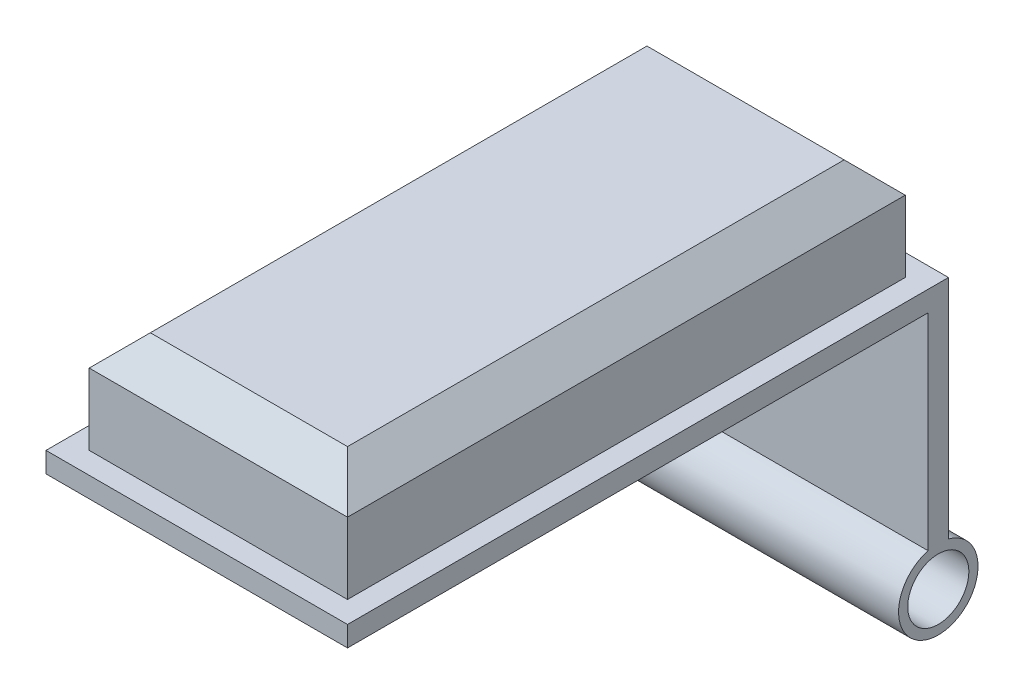
ISO-10303-21;
HEADER;
FILE_DESCRIPTION(('STEP AP214'),'2;1');
FILE_NAME('part.step','',(''),(''),'','','');
FILE_SCHEMA(('AUTOMOTIVE_DESIGN { 1 0 10303 214 1 1 1 1 }'));
ENDSEC;
DATA;
#1=APPLICATION_CONTEXT('core data for automotive mechanical design processes');
#2=APPLICATION_PROTOCOL_DEFINITION('international standard','automotive_design',2000,#1);
#3=PRODUCT_CONTEXT('',#1,'mechanical');
#4=PRODUCT('Part','Part','',(#3));
#5=PRODUCT_RELATED_PRODUCT_CATEGORY('part','',(#4));
#6=PRODUCT_DEFINITION_FORMATION('','',#4);
#7=PRODUCT_DEFINITION_CONTEXT('part definition',#1,'design');
#8=PRODUCT_DEFINITION('design','',#6,#7);
#9=PRODUCT_DEFINITION_SHAPE('','',#8);
#10=(LENGTH_UNIT() NAMED_UNIT(*) SI_UNIT(.MILLI.,.METRE.));
#11=(NAMED_UNIT(*) PLANE_ANGLE_UNIT() SI_UNIT($,.RADIAN.));
#12=(NAMED_UNIT(*) SI_UNIT($,.STERADIAN.) SOLID_ANGLE_UNIT());
#13=UNCERTAINTY_MEASURE_WITH_UNIT(LENGTH_MEASURE(1.E-05),#10,'distance_accuracy_value','');
#14=(GEOMETRIC_REPRESENTATION_CONTEXT(3) GLOBAL_UNCERTAINTY_ASSIGNED_CONTEXT((#13)) GLOBAL_UNIT_ASSIGNED_CONTEXT((#10,
#11,#12)) REPRESENTATION_CONTEXT('',''));
#15=CARTESIAN_POINT('',(0.,0.,0.));
#16=DIRECTION('',(0.,0.,1.));
#17=DIRECTION('',(1.,0.,0.));
#18=AXIS2_PLACEMENT_3D('',#15,#16,#17);
#19=CARTESIAN_POINT('',(0.,12.9969134233995,29.));
#20=DIRECTION('',(0.,1.,0.));
#21=DIRECTION('',(0.,0.,1.));
#22=AXIS2_PLACEMENT_3D('',#19,#20,#21);
#23=PLANE('',#22);
#24=DIRECTION('',(0.,0.,-1.));
#25=VECTOR('',#24,1.);
#26=CARTESIAN_POINT('',(0.,12.9969134233995,0.));
#27=LINE('',#26,#25);
#28=CARTESIAN_POINT('',(0.,12.9969134233995,29.));
#29=VERTEX_POINT('',#28);
#30=CARTESIAN_POINT('',(0.,12.9969134233995,-0.498993341804118));
#31=VERTEX_POINT('',#30);
#32=EDGE_CURVE('E158',#29,#31,#27,.T.);
#33=ORIENTED_EDGE('',*,*,#32,.F.);
#34=DIRECTION('',(1.,0.,0.));
#35=VECTOR('',#34,1.);
#36=CARTESIAN_POINT('',(0.,12.9969134233995,29.));
#37=LINE('',#36,#35);
#38=CARTESIAN_POINT('',(14.8,12.9969134233995,29.));
#39=VERTEX_POINT('',#38);
#40=EDGE_CURVE('E12',#29,#39,#37,.T.);
#41=ORIENTED_EDGE('',*,*,#40,.T.);
#42=DIRECTION('',(0.,0.,-1.));
#43=VECTOR('',#42,1.);
#44=CARTESIAN_POINT('',(14.8,12.9969134233995,0.));
#45=LINE('',#44,#43);
#46=CARTESIAN_POINT('',(14.8,12.9969134233995,-0.498993341804118));
#47=VERTEX_POINT('',#46);
#48=EDGE_CURVE('E62',#39,#47,#45,.T.);
#49=ORIENTED_EDGE('',*,*,#48,.T.);
#50=DIRECTION('',(-1.,0.,0.));
#51=VECTOR('',#50,1.);
#52=CARTESIAN_POINT('',(14.8,12.9969134233995,-0.498993341804118));
#53=LINE('',#52,#51);
#54=EDGE_CURVE('E150',#47,#31,#53,.T.);
#55=ORIENTED_EDGE('',*,*,#54,.T.);
#56=EDGE_LOOP('',(#33,#41,#49,#55));
#57=FACE_BOUND('',#56,.T.);
#58=ADVANCED_FACE('F45',(#57),#23,.T.);
#59=CARTESIAN_POINT('',(14.8,0.,0.50100665819588));
#60=DIRECTION('',(0.,0.,-1.));
#61=DIRECTION('',(0.,1.,0.));
#62=AXIS2_PLACEMENT_3D('',#59,#60,#61);
#63=PLANE('',#62);
#64=DIRECTION('',(1.,0.,0.));
#65=VECTOR('',#64,1.);
#66=CARTESIAN_POINT('',(0.,11.9969134233995,0.501006658195882));
#67=LINE('',#66,#65);
#68=CARTESIAN_POINT('',(0.,11.9969134233995,0.501006658195882));
#69=VERTEX_POINT('',#68);
#70=CARTESIAN_POINT('',(14.8,11.9969134233995,0.501006658195882));
#71=VERTEX_POINT('',#70);
#72=EDGE_CURVE('E97',#69,#71,#67,.T.);
#73=ORIENTED_EDGE('',*,*,#72,.F.);
#74=DIRECTION('',(0.,-1.,0.));
#75=VECTOR('',#74,1.);
#76=CARTESIAN_POINT('',(0.,0.,0.50100665819588));
#77=LINE('',#76,#75);
#78=CARTESIAN_POINT('',(0.,1.88157923576154,0.501006658195881));
#79=VERTEX_POINT('',#78);
#80=EDGE_CURVE('E77',#69,#79,#77,.T.);
#81=ORIENTED_EDGE('',*,*,#80,.T.);
#82=DIRECTION('',(-1.,0.,0.));
#83=VECTOR('',#82,1.);
#84=CARTESIAN_POINT('',(14.8,1.88157923576154,0.501006658195881));
#85=LINE('',#84,#83);
#86=CARTESIAN_POINT('',(14.8,1.88157923576154,0.501006658195881));
#87=VERTEX_POINT('',#86);
#88=EDGE_CURVE('E180',#87,#79,#85,.T.);
#89=ORIENTED_EDGE('',*,*,#88,.F.);
#90=DIRECTION('',(0.,-1.,0.));
#91=VECTOR('',#90,1.);
#92=CARTESIAN_POINT('',(14.8,0.,0.50100665819588));
#93=LINE('',#92,#91);
#94=EDGE_CURVE('E163',#71,#87,#93,.T.);
#95=ORIENTED_EDGE('',*,*,#94,.F.);
#96=EDGE_LOOP('',(#73,#81,#89,#95));
#97=FACE_BOUND('',#96,.T.);
#98=ADVANCED_FACE('F121',(#97),#63,.F.);
#99=CARTESIAN_POINT('',(14.8,-0.0030865766004935,0.00047216816173915));
#100=DIRECTION('',(-1.,0.,0.));
#101=DIRECTION('',(0.,0.,1.));
#102=AXIS2_PLACEMENT_3D('',#99,#100,#101);
#103=CYLINDRICAL_SURFACE('',#102,1.95);
#104=CARTESIAN_POINT('',(0.,-0.0030865766004935,0.00047216816173915));
#105=DIRECTION('',(1.,0.,0.));
#106=DIRECTION('',(0.,0.,-1.));
#107=AXIS2_PLACEMENT_3D('',#104,#105,#106);
#108=CIRCLE('',#107,1.95);
#109=CARTESIAN_POINT('',(0.,1.88186281379558,-0.498993341804119));
#110=VERTEX_POINT('',#109);
#111=EDGE_CURVE('E157',#79,#110,#108,.T.);
#112=ORIENTED_EDGE('',*,*,#111,.T.);
#113=DIRECTION('',(-1.,0.,0.));
#114=VECTOR('',#113,1.);
#115=CARTESIAN_POINT('',(14.8,1.88186281379558,-0.498993341804119));
#116=LINE('',#115,#114);
#117=CARTESIAN_POINT('',(14.8,1.88186281379558,-0.498993341804119));
#118=VERTEX_POINT('',#117);
#119=EDGE_CURVE('E153',#118,#110,#116,.T.);
#120=ORIENTED_EDGE('',*,*,#119,.F.);
#121=CARTESIAN_POINT('',(14.8,-0.0030865766004935,0.00047216816173915));
#122=DIRECTION('',(1.,0.,0.));
#123=DIRECTION('',(0.,0.,-1.));
#124=AXIS2_PLACEMENT_3D('',#121,#122,#123);
#125=CIRCLE('',#124,1.95);
#126=EDGE_CURVE('E172',#87,#118,#125,.T.);
#127=ORIENTED_EDGE('',*,*,#126,.F.);
#128=ORIENTED_EDGE('',*,*,#88,.T.);
#129=EDGE_LOOP('',(#112,#120,#127,#128));
#130=FACE_BOUND('',#129,.T.);
#131=ADVANCED_FACE('F123',(#130),#103,.T.);
#132=CARTESIAN_POINT('',(14.8,0.,-0.498993341804119));
#133=DIRECTION('',(0.,0.,-1.));
#134=DIRECTION('',(0.,1.,0.));
#135=AXIS2_PLACEMENT_3D('',#132,#133,#134);
#136=PLANE('',#135);
#137=DIRECTION('',(0.,-1.,0.));
#138=VECTOR('',#137,1.);
#139=CARTESIAN_POINT('',(0.,0.,-0.498993341804119));
#140=LINE('',#139,#138);
#141=EDGE_CURVE('E146',#31,#110,#140,.T.);
#142=ORIENTED_EDGE('',*,*,#141,.F.);
#143=ORIENTED_EDGE('',*,*,#54,.F.);
#144=DIRECTION('',(0.,-1.,0.));
#145=VECTOR('',#144,1.);
#146=CARTESIAN_POINT('',(14.8,0.,-0.498993341804119));
#147=LINE('',#146,#145);
#148=EDGE_CURVE('E170',#47,#118,#147,.T.);
#149=ORIENTED_EDGE('',*,*,#148,.T.);
#150=ORIENTED_EDGE('',*,*,#119,.T.);
#151=EDGE_LOOP('',(#142,#143,#149,#150));
#152=FACE_BOUND('',#151,.T.);
#153=ADVANCED_FACE('F130',(#152),#136,.T.);
#154=CARTESIAN_POINT('',(14.8,-0.0030865766004935,0.00047216816173915));
#155=DIRECTION('',(-1.,0.,0.));
#156=DIRECTION('',(0.,0.,1.));
#157=AXIS2_PLACEMENT_3D('',#154,#155,#156);
#158=CYLINDRICAL_SURFACE('',#157,1.5);
#159=CARTESIAN_POINT('',(14.8,-0.0030865766004935,0.00047216816173915));
#160=DIRECTION('',(1.,0.,0.));
#161=DIRECTION('',(0.,0.,-1.));
#162=AXIS2_PLACEMENT_3D('',#159,#160,#161);
#163=CIRCLE('',#162,1.5);
#164=CARTESIAN_POINT('',(14.8,-0.0030865766004935,-1.49952783183826));
#165=VERTEX_POINT('',#164);
#166=EDGE_CURVE('E160',#165,#165,#163,.T.);
#167=ORIENTED_EDGE('',*,*,#166,.T.);
#168=EDGE_LOOP('',(#167));
#169=FACE_BOUND('',#168,.T.);
#170=CARTESIAN_POINT('',(0.,-0.0030865766004935,0.00047216816173915));
#171=DIRECTION('',(1.,0.,0.));
#172=DIRECTION('',(0.,0.,-1.));
#173=AXIS2_PLACEMENT_3D('',#170,#171,#172);
#174=CIRCLE('',#173,1.5);
#175=CARTESIAN_POINT('',(0.,-0.0030865766004935,-1.49952783183826));
#176=VERTEX_POINT('',#175);
#177=EDGE_CURVE('E101',#176,#176,#174,.T.);
#178=ORIENTED_EDGE('',*,*,#177,.F.);
#179=EDGE_LOOP('',(#178));
#180=FACE_BOUND('',#179,.T.);
#181=ADVANCED_FACE('F117',(#169,#180),#158,.F.);
#182=CARTESIAN_POINT('',(14.8,0.,0.));
#183=DIRECTION('',(1.,0.,0.));
#184=DIRECTION('',(0.,0.,-1.));
#185=AXIS2_PLACEMENT_3D('',#182,#183,#184);
#186=PLANE('',#185);
#187=ORIENTED_EDGE('',*,*,#166,.F.);
#188=EDGE_LOOP('',(#187));
#189=FACE_BOUND('',#188,.T.);
#190=ORIENTED_EDGE('',*,*,#48,.F.);
#191=DIRECTION('',(0.,1.,0.));
#192=VECTOR('',#191,1.);
#193=CARTESIAN_POINT('',(14.8,11.9969134233995,29.));
#194=LINE('',#193,#192);
#195=CARTESIAN_POINT('',(14.8,11.9969134233995,29.));
#196=VERTEX_POINT('',#195);
#197=EDGE_CURVE('E80',#196,#39,#194,.T.);
#198=ORIENTED_EDGE('',*,*,#197,.F.);
#199=DIRECTION('',(0.,0.,-1.));
#200=VECTOR('',#199,1.);
#201=CARTESIAN_POINT('',(14.8,11.9969134233995,0.));
#202=LINE('',#201,#200);
#203=EDGE_CURVE('E85',#196,#71,#202,.T.);
#204=ORIENTED_EDGE('',*,*,#203,.T.);
#205=ORIENTED_EDGE('',*,*,#94,.T.);
#206=ORIENTED_EDGE('',*,*,#126,.T.);
#207=ORIENTED_EDGE('',*,*,#148,.F.);
#208=EDGE_LOOP('',(#190,#198,#204,#205,#206,#207));
#209=FACE_BOUND('',#208,.T.);
#210=ADVANCED_FACE('F82',(#189,#209),#186,.T.);
#211=CARTESIAN_POINT('',(0.,0.,0.));
#212=DIRECTION('',(1.,0.,0.));
#213=DIRECTION('',(0.,0.,-1.));
#214=AXIS2_PLACEMENT_3D('',#211,#212,#213);
#215=PLANE('',#214);
#216=ORIENTED_EDGE('',*,*,#177,.T.);
#217=EDGE_LOOP('',(#216));
#218=FACE_BOUND('',#217,.T.);
#219=ORIENTED_EDGE('',*,*,#80,.F.);
#220=DIRECTION('',(0.,0.,1.));
#221=VECTOR('',#220,1.);
#222=CARTESIAN_POINT('',(0.,11.9969134233995,0.));
#223=LINE('',#222,#221);
#224=CARTESIAN_POINT('',(0.,11.9969134233995,29.));
#225=VERTEX_POINT('',#224);
#226=EDGE_CURVE('E89',#69,#225,#223,.T.);
#227=ORIENTED_EDGE('',*,*,#226,.T.);
#228=DIRECTION('',(0.,1.,0.));
#229=VECTOR('',#228,1.);
#230=CARTESIAN_POINT('',(0.,11.9969134233995,29.));
#231=LINE('',#230,#229);
#232=EDGE_CURVE('E90',#225,#29,#231,.T.);
#233=ORIENTED_EDGE('',*,*,#232,.T.);
#234=ORIENTED_EDGE('',*,*,#32,.T.);
#235=ORIENTED_EDGE('',*,*,#141,.T.);
#236=ORIENTED_EDGE('',*,*,#111,.F.);
#237=EDGE_LOOP('',(#219,#227,#233,#234,#235,#236));
#238=FACE_BOUND('',#237,.T.);
#239=ADVANCED_FACE('F108',(#218,#238),#215,.F.);
#240=CARTESIAN_POINT('',(0.,11.9969134233995,29.));
#241=DIRECTION('',(0.,0.,1.));
#242=DIRECTION('',(1.,0.,0.));
#243=AXIS2_PLACEMENT_3D('',#240,#241,#242);
#244=PLANE('',#243);
#245=ORIENTED_EDGE('',*,*,#40,.F.);
#246=ORIENTED_EDGE('',*,*,#232,.F.);
#247=DIRECTION('',(1.,0.,0.));
#248=VECTOR('',#247,1.);
#249=CARTESIAN_POINT('',(0.,11.9969134233995,29.));
#250=LINE('',#249,#248);
#251=EDGE_CURVE('E48',#225,#196,#250,.T.);
#252=ORIENTED_EDGE('',*,*,#251,.T.);
#253=ORIENTED_EDGE('',*,*,#197,.T.);
#254=EDGE_LOOP('',(#245,#246,#252,#253));
#255=FACE_BOUND('',#254,.T.);
#256=ADVANCED_FACE('F98',(#255),#244,.T.);
#257=CARTESIAN_POINT('',(0.,11.9969134233995,0.));
#258=DIRECTION('',(0.,1.,0.));
#259=DIRECTION('',(0.,0.,1.));
#260=AXIS2_PLACEMENT_3D('',#257,#258,#259);
#261=PLANE('',#260);
#262=ORIENTED_EDGE('',*,*,#251,.F.);
#263=ORIENTED_EDGE('',*,*,#226,.F.);
#264=ORIENTED_EDGE('',*,*,#72,.T.);
#265=ORIENTED_EDGE('',*,*,#203,.F.);
#266=EDGE_LOOP('',(#262,#263,#264,#265));
#267=FACE_BOUND('',#266,.T.);
#268=ADVANCED_FACE('F95',(#267),#261,.F.);
#269=CLOSED_SHELL('',(#58,#98,#131,#153,#181,#210,#239,#256,#268));
#270=MANIFOLD_SOLID_BREP('B2',#269);
#271=CARTESIAN_POINT('',(0.,12.9969134233995,29.));
#272=DIRECTION('',(0.,1.,0.));
#273=DIRECTION('',(0.,0.,1.));
#274=AXIS2_PLACEMENT_3D('',#271,#272,#273);
#275=PLANE('',#274);
#276=DIRECTION('',(0.,0.,1.));
#277=VECTOR('',#276,1.);
#278=CARTESIAN_POINT('',(13.7393398282202,12.9969134233995,0.));
#279=LINE('',#278,#277);
#280=CARTESIAN_POINT('',(13.7393398282202,12.9969134233995,0.561666829975703));
#281=VERTEX_POINT('',#280);
#282=CARTESIAN_POINT('',(13.7393398282202,12.9969134233995,27.9393398282202));
#283=VERTEX_POINT('',#282);
#284=EDGE_CURVE('E43',#281,#283,#279,.T.);
#285=ORIENTED_EDGE('',*,*,#284,.T.);
#286=DIRECTION('',(1.,0.,0.));
#287=VECTOR('',#286,1.);
#288=CARTESIAN_POINT('',(0.,12.9969134233995,27.9393398282202));
#289=LINE('',#288,#287);
#290=CARTESIAN_POINT('',(1.06066017177982,12.9969134233995,27.9393398282202));
#291=VERTEX_POINT('',#290);
#292=EDGE_CURVE('E289',#291,#283,#289,.T.);
#293=ORIENTED_EDGE('',*,*,#292,.F.);
#294=DIRECTION('',(0.,0.,1.));
#295=VECTOR('',#294,1.);
#296=CARTESIAN_POINT('',(1.06066017177982,12.9969134233995,0.));
#297=LINE('',#296,#295);
#298=CARTESIAN_POINT('',(1.06066017177982,12.9969134233995,0.561666829975703));
#299=VERTEX_POINT('',#298);
#300=EDGE_CURVE('E321',#299,#291,#297,.T.);
#301=ORIENTED_EDGE('',*,*,#300,.F.);
#302=DIRECTION('',(1.,0.,0.));
#303=VECTOR('',#302,1.);
#304=CARTESIAN_POINT('',(0.,12.9969134233995,0.561666829975703));
#305=LINE('',#304,#303);
#306=EDGE_CURVE('E274',#299,#281,#305,.T.);
#307=ORIENTED_EDGE('',*,*,#306,.T.);
#308=EDGE_LOOP('',(#285,#293,#301,#307));
#309=FACE_BOUND('',#308,.T.);
#310=ADVANCED_FACE('F266',(#309),#275,.F.);
#311=CARTESIAN_POINT('',(0.,17.9969134233995,0.));
#312=DIRECTION('',(0.,1.,0.));
#313=DIRECTION('',(0.,0.,1.));
#314=AXIS2_PLACEMENT_3D('',#311,#312,#313);
#315=PLANE('',#314);
#316=DIRECTION('',(0.,0.,1.));
#317=VECTOR('',#316,1.);
#318=CARTESIAN_POINT('',(2.56066017177982,17.9969134233995,27.9393398282202));
#319=LINE('',#318,#317);
#320=CARTESIAN_POINT('',(2.56066017177982,17.9969134233995,2.06166682997571));
#321=VERTEX_POINT('',#320);
#322=CARTESIAN_POINT('',(2.56066017177982,17.9969134233995,26.4393398282202));
#323=VERTEX_POINT('',#322);
#324=EDGE_CURVE('E345',#321,#323,#319,.T.);
#325=ORIENTED_EDGE('',*,*,#324,.T.);
#326=DIRECTION('',(1.,0.,0.));
#327=VECTOR('',#326,1.);
#328=CARTESIAN_POINT('',(13.7393398282202,17.9969134233995,26.4393398282202));
#329=LINE('',#328,#327);
#330=CARTESIAN_POINT('',(12.2393398282202,17.9969134233995,26.4393398282202));
#331=VERTEX_POINT('',#330);
#332=EDGE_CURVE('E347',#323,#331,#329,.T.);
#333=ORIENTED_EDGE('',*,*,#332,.T.);
#334=DIRECTION('',(0.,0.,-1.));
#335=VECTOR('',#334,1.);
#336=CARTESIAN_POINT('',(12.2393398282202,17.9969134233995,0.));
#337=LINE('',#336,#335);
#338=CARTESIAN_POINT('',(12.2393398282202,17.9969134233995,2.06166682997571));
#339=VERTEX_POINT('',#338);
#340=EDGE_CURVE('E341',#331,#339,#337,.T.);
#341=ORIENTED_EDGE('',*,*,#340,.T.);
#342=DIRECTION('',(-1.,0.,0.));
#343=VECTOR('',#342,1.);
#344=CARTESIAN_POINT('',(0.,17.9969134233995,2.06166682997571));
#345=LINE('',#344,#343);
#346=EDGE_CURVE('E343',#339,#321,#345,.T.);
#347=ORIENTED_EDGE('',*,*,#346,.T.);
#348=EDGE_LOOP('',(#325,#333,#341,#347));
#349=FACE_BOUND('',#348,.T.);
#350=ADVANCED_FACE('F387',(#349),#315,.T.);
#351=CARTESIAN_POINT('',(13.7393398282202,16.4969134233995,0.));
#352=DIRECTION('',(-0.707106781186546,-0.707106781186549,0.));
#353=DIRECTION('',(0.,0.,1.));
#354=AXIS2_PLACEMENT_3D('',#351,#352,#353);
#355=PLANE('',#354);
#356=DIRECTION('',(-0.577350269189627,0.577350269189624,0.577350269189627));
#357=VECTOR('',#356,1.);
#358=CARTESIAN_POINT('',(13.9265621048787,16.3096911467409,0.374444553317135));
#359=LINE('',#358,#357);
#360=CARTESIAN_POINT('',(13.7393398282202,16.4969134233995,0.561666829975703));
#361=VERTEX_POINT('',#360);
#362=EDGE_CURVE('E360',#361,#339,#359,.T.);
#363=ORIENTED_EDGE('',*,*,#362,.T.);
#364=ORIENTED_EDGE('',*,*,#340,.F.);
#365=DIRECTION('',(-0.577350269189627,0.577350269189624,-0.577350269189627));
#366=VECTOR('',#365,1.);
#367=CARTESIAN_POINT('',(4.42622655214675,25.8100266994729,18.6262265521468));
#368=LINE('',#367,#366);
#369=CARTESIAN_POINT('',(13.7393398282202,16.4969134233995,27.9393398282202));
#370=VERTEX_POINT('',#369);
#371=EDGE_CURVE('E357',#370,#331,#368,.T.);
#372=ORIENTED_EDGE('',*,*,#371,.F.);
#373=DIRECTION('',(0.,0.,1.));
#374=VECTOR('',#373,1.);
#375=CARTESIAN_POINT('',(13.7393398282202,16.4969134233995,0.));
#376=LINE('',#375,#374);
#377=EDGE_CURVE('E355',#361,#370,#376,.T.);
#378=ORIENTED_EDGE('',*,*,#377,.F.);
#379=EDGE_LOOP('',(#363,#364,#372,#378));
#380=FACE_BOUND('',#379,.T.);
#381=ADVANCED_FACE('F385',(#380),#355,.F.);
#382=CARTESIAN_POINT('',(0.,16.4969134233995,0.561666829975703));
#383=DIRECTION('',(0.,-0.707106781186549,0.707106781186546));
#384=DIRECTION('',(1.,0.,0.));
#385=AXIS2_PLACEMENT_3D('',#382,#383,#384);
#386=PLANE('',#385);
#387=ORIENTED_EDGE('',*,*,#362,.F.);
#388=DIRECTION('',(1.,0.,0.));
#389=VECTOR('',#388,1.);
#390=CARTESIAN_POINT('',(0.,16.4969134233995,0.561666829975703));
#391=LINE('',#390,#389);
#392=CARTESIAN_POINT('',(1.06066017177982,16.4969134233995,0.561666829975703));
#393=VERTEX_POINT('',#392);
#394=EDGE_CURVE('E353',#393,#361,#391,.T.);
#395=ORIENTED_EDGE('',*,*,#394,.F.);
#396=DIRECTION('',(-0.577350269189627,-0.577350269189624,-0.577350269189627));
#397=VECTOR('',#396,1.);
#398=CARTESIAN_POINT('',(0.707106781186546,16.1433600328062,0.208113439382429));
#399=LINE('',#398,#397);
#400=EDGE_CURVE('E269',#321,#393,#399,.T.);
#401=ORIENTED_EDGE('',*,*,#400,.F.);
#402=ORIENTED_EDGE('',*,*,#346,.F.);
#403=EDGE_LOOP('',(#387,#395,#401,#402));
#404=FACE_BOUND('',#403,.T.);
#405=ADVANCED_FACE('F376',(#404),#386,.F.);
#406=CARTESIAN_POINT('',(0.,17.9969134233995,0.561666829975703));
#407=DIRECTION('',(0.,0.,-1.));
#408=DIRECTION('',(-1.,0.,0.));
#409=AXIS2_PLACEMENT_3D('',#406,#407,#408);
#410=PLANE('',#409);
#411=DIRECTION('',(0.,-1.,0.));
#412=VECTOR('',#411,1.);
#413=CARTESIAN_POINT('',(1.06066017177982,17.9969134233995,0.561666829975703));
#414=LINE('',#413,#412);
#415=EDGE_CURVE('E324',#393,#299,#414,.T.);
#416=ORIENTED_EDGE('',*,*,#415,.F.);
#417=ORIENTED_EDGE('',*,*,#394,.T.);
#418=DIRECTION('',(0.,-1.,0.));
#419=VECTOR('',#418,1.);
#420=CARTESIAN_POINT('',(13.7393398282202,17.9969134233995,0.561666829975703));
#421=LINE('',#420,#419);
#422=EDGE_CURVE('E336',#361,#281,#421,.T.);
#423=ORIENTED_EDGE('',*,*,#422,.T.);
#424=ORIENTED_EDGE('',*,*,#306,.F.);
#425=EDGE_LOOP('',(#416,#417,#423,#424));
#426=FACE_BOUND('',#425,.T.);
#427=ADVANCED_FACE('F378',(#426),#410,.T.);
#428=CARTESIAN_POINT('',(2.56066017177982,17.9969134233995,0.));
#429=DIRECTION('',(-0.707106781186546,0.707106781186549,0.));
#430=DIRECTION('',(0.,0.,-1.));
#431=AXIS2_PLACEMENT_3D('',#428,#429,#430);
#432=PLANE('',#431);
#433=ORIENTED_EDGE('',*,*,#400,.T.);
#434=DIRECTION('',(0.,0.,-1.));
#435=VECTOR('',#434,1.);
#436=CARTESIAN_POINT('',(1.06066017177982,16.4969134233995,0.561666829975703));
#437=LINE('',#436,#435);
#438=CARTESIAN_POINT('',(1.06066017177982,16.4969134233995,27.9393398282202));
#439=VERTEX_POINT('',#438);
#440=EDGE_CURVE('E351',#439,#393,#437,.T.);
#441=ORIENTED_EDGE('',*,*,#440,.F.);
#442=DIRECTION('',(0.577350269189627,0.577350269189624,-0.577350269189627));
#443=VECTOR('',#442,1.);
#444=CARTESIAN_POINT('',(11.3737734478532,26.8100266994729,17.6262265521468));
#445=LINE('',#444,#443);
#446=EDGE_CURVE('E359',#323,#439,#445,.F.);
#447=ORIENTED_EDGE('',*,*,#446,.F.);
#448=ORIENTED_EDGE('',*,*,#324,.F.);
#449=EDGE_LOOP('',(#433,#441,#447,#448));
#450=FACE_BOUND('',#449,.T.);
#451=ADVANCED_FACE('F371',(#450),#432,.T.);
#452=CARTESIAN_POINT('',(1.06066017177982,17.9969134233995,0.));
#453=DIRECTION('',(1.,0.,0.));
#454=DIRECTION('',(0.,0.,-1.));
#455=AXIS2_PLACEMENT_3D('',#452,#453,#454);
#456=PLANE('',#455);
#457=DIRECTION('',(0.,-1.,0.));
#458=VECTOR('',#457,1.);
#459=CARTESIAN_POINT('',(1.06066017177982,17.9969134233995,27.9393398282202));
#460=LINE('',#459,#458);
#461=EDGE_CURVE('E323',#439,#291,#460,.T.);
#462=ORIENTED_EDGE('',*,*,#461,.F.);
#463=ORIENTED_EDGE('',*,*,#440,.T.);
#464=ORIENTED_EDGE('',*,*,#415,.T.);
#465=ORIENTED_EDGE('',*,*,#300,.T.);
#466=EDGE_LOOP('',(#462,#463,#464,#465));
#467=FACE_BOUND('',#466,.T.);
#468=ADVANCED_FACE('F322',(#467),#456,.F.);
#469=CARTESIAN_POINT('',(0.,17.9969134233995,26.4393398282202));
#470=DIRECTION('',(0.,0.707106781186549,0.707106781186546));
#471=DIRECTION('',(-1.,0.,0.));
#472=AXIS2_PLACEMENT_3D('',#469,#470,#471);
#473=PLANE('',#472);
#474=ORIENTED_EDGE('',*,*,#446,.T.);
#475=DIRECTION('',(-1.,0.,0.));
#476=VECTOR('',#475,1.);
#477=CARTESIAN_POINT('',(1.06066017177982,16.4969134233995,27.9393398282202));
#478=LINE('',#477,#476);
#479=EDGE_CURVE('E334',#370,#439,#478,.T.);
#480=ORIENTED_EDGE('',*,*,#479,.F.);
#481=ORIENTED_EDGE('',*,*,#371,.T.);
#482=ORIENTED_EDGE('',*,*,#332,.F.);
#483=EDGE_LOOP('',(#474,#480,#481,#482));
#484=FACE_BOUND('',#483,.T.);
#485=ADVANCED_FACE('F383',(#484),#473,.T.);
#486=CARTESIAN_POINT('',(13.7393398282202,17.9969134233995,0.));
#487=DIRECTION('',(1.,0.,0.));
#488=DIRECTION('',(0.,0.,-1.));
#489=AXIS2_PLACEMENT_3D('',#486,#487,#488);
#490=PLANE('',#489);
#491=ORIENTED_EDGE('',*,*,#422,.F.);
#492=ORIENTED_EDGE('',*,*,#377,.T.);
#493=DIRECTION('',(0.,-1.,0.));
#494=VECTOR('',#493,1.);
#495=CARTESIAN_POINT('',(13.7393398282202,17.9969134233995,27.9393398282202));
#496=LINE('',#495,#494);
#497=EDGE_CURVE('E329',#370,#283,#496,.T.);
#498=ORIENTED_EDGE('',*,*,#497,.T.);
#499=ORIENTED_EDGE('',*,*,#284,.F.);
#500=EDGE_LOOP('',(#491,#492,#498,#499));
#501=FACE_BOUND('',#500,.T.);
#502=ADVANCED_FACE('F380',(#501),#490,.T.);
#503=CARTESIAN_POINT('',(0.,17.9969134233995,27.9393398282202));
#504=DIRECTION('',(0.,0.,-1.));
#505=DIRECTION('',(-1.,0.,0.));
#506=AXIS2_PLACEMENT_3D('',#503,#504,#505);
#507=PLANE('',#506);
#508=ORIENTED_EDGE('',*,*,#497,.F.);
#509=ORIENTED_EDGE('',*,*,#479,.T.);
#510=ORIENTED_EDGE('',*,*,#461,.T.);
#511=ORIENTED_EDGE('',*,*,#292,.T.);
#512=EDGE_LOOP('',(#508,#509,#510,#511));
#513=FACE_BOUND('',#512,.T.);
#514=ADVANCED_FACE('F332',(#513),#507,.F.);
#515=CLOSED_SHELL('',(#310,#350,#381,#405,#427,#451,#468,#485,#502,#514));
#516=MANIFOLD_SOLID_BREP('B6',#515);
#517=ADVANCED_BREP_SHAPE_REPRESENTATION('',(#18,#270,#516),#14);
#518=SHAPE_DEFINITION_REPRESENTATION(#9,#517);
ENDSEC;
END-ISO-10303-21;
